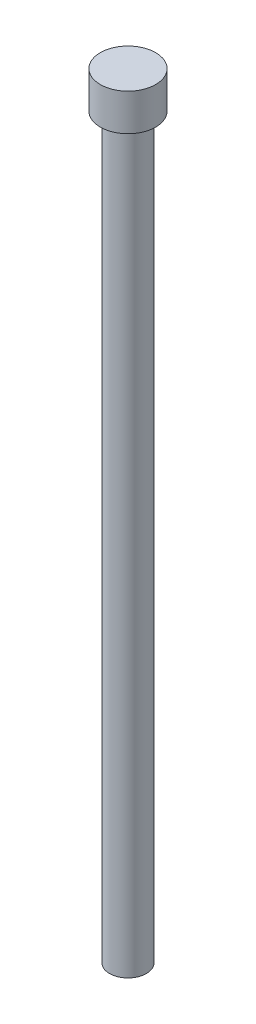
ISO-10303-21;
HEADER;
FILE_DESCRIPTION(('STEP AP214'),'2;1');
FILE_NAME('part.step','',(''),(''),'','','');
FILE_SCHEMA(('AUTOMOTIVE_DESIGN { 1 0 10303 214 1 1 1 1 }'));
ENDSEC;
DATA;
#1=APPLICATION_CONTEXT('core data for automotive mechanical design processes');
#2=APPLICATION_PROTOCOL_DEFINITION('international standard','automotive_design',2000,#1);
#3=PRODUCT_CONTEXT('',#1,'mechanical');
#4=PRODUCT('Part','Part','',(#3));
#5=PRODUCT_RELATED_PRODUCT_CATEGORY('part','',(#4));
#6=PRODUCT_DEFINITION_FORMATION('','',#4);
#7=PRODUCT_DEFINITION_CONTEXT('part definition',#1,'design');
#8=PRODUCT_DEFINITION('design','',#6,#7);
#9=PRODUCT_DEFINITION_SHAPE('','',#8);
#10=(LENGTH_UNIT() NAMED_UNIT(*) SI_UNIT(.MILLI.,.METRE.));
#11=(NAMED_UNIT(*) PLANE_ANGLE_UNIT() SI_UNIT($,.RADIAN.));
#12=(NAMED_UNIT(*) SI_UNIT($,.STERADIAN.) SOLID_ANGLE_UNIT());
#13=UNCERTAINTY_MEASURE_WITH_UNIT(LENGTH_MEASURE(1.E-05),#10,'distance_accuracy_value','');
#14=(GEOMETRIC_REPRESENTATION_CONTEXT(3) GLOBAL_UNCERTAINTY_ASSIGNED_CONTEXT((#13)) GLOBAL_UNIT_ASSIGNED_CONTEXT((#10,
#11,#12)) REPRESENTATION_CONTEXT('',''));
#15=CARTESIAN_POINT('',(0.,0.,0.));
#16=DIRECTION('',(0.,0.,1.));
#17=DIRECTION('',(1.,0.,0.));
#18=AXIS2_PLACEMENT_3D('',#15,#16,#17);
#19=CARTESIAN_POINT('',(0.,6.35,0.));
#20=DIRECTION('',(0.,-1.,0.));
#21=DIRECTION('',(0.,0.,-1.));
#22=AXIS2_PLACEMENT_3D('',#19,#20,#21);
#23=CYLINDRICAL_SURFACE('',#22,4.7625);
#24=CARTESIAN_POINT('',(0.,6.35,0.));
#25=DIRECTION('',(0.,1.,0.));
#26=DIRECTION('',(0.,0.,1.));
#27=AXIS2_PLACEMENT_3D('',#24,#25,#26);
#28=CIRCLE('',#27,4.7625);
#29=CARTESIAN_POINT('',(0.,6.35,4.7625));
#30=VERTEX_POINT('',#29);
#31=EDGE_CURVE('E38',#30,#30,#28,.T.);
#32=ORIENTED_EDGE('',*,*,#31,.F.);
#33=EDGE_LOOP('',(#32));
#34=FACE_BOUND('',#33,.T.);
#35=CARTESIAN_POINT('',(0.,0.,0.));
#36=DIRECTION('',(0.,1.,0.));
#37=DIRECTION('',(0.,0.,1.));
#38=AXIS2_PLACEMENT_3D('',#35,#36,#37);
#39=CIRCLE('',#38,4.7625);
#40=CARTESIAN_POINT('',(0.,0.,4.7625));
#41=VERTEX_POINT('',#40);
#42=EDGE_CURVE('E34',#41,#41,#39,.T.);
#43=ORIENTED_EDGE('',*,*,#42,.T.);
#44=EDGE_LOOP('',(#43));
#45=FACE_BOUND('',#44,.T.);
#46=ADVANCED_FACE('F31',(#34,#45),#23,.T.);
#47=CARTESIAN_POINT('',(0.,6.35,0.));
#48=DIRECTION('',(0.,1.,0.));
#49=DIRECTION('',(0.,0.,1.));
#50=AXIS2_PLACEMENT_3D('',#47,#48,#49);
#51=PLANE('',#50);
#52=ORIENTED_EDGE('',*,*,#31,.T.);
#53=EDGE_LOOP('',(#52));
#54=FACE_BOUND('',#53,.T.);
#55=ADVANCED_FACE('F55',(#54),#51,.T.);
#56=CARTESIAN_POINT('',(0.,0.,0.));
#57=DIRECTION('',(0.,1.,0.));
#58=DIRECTION('',(0.,0.,1.));
#59=AXIS2_PLACEMENT_3D('',#56,#57,#58);
#60=PLANE('',#59);
#61=CARTESIAN_POINT('',(0.,0.,0.));
#62=DIRECTION('',(0.,-1.,0.));
#63=DIRECTION('',(0.,0.,-1.));
#64=AXIS2_PLACEMENT_3D('',#61,#62,#63);
#65=CIRCLE('',#64,3.175);
#66=CARTESIAN_POINT('',(0.,0.,-3.175));
#67=VERTEX_POINT('',#66);
#68=EDGE_CURVE('E10',#67,#67,#65,.T.);
#69=ORIENTED_EDGE('',*,*,#68,.F.);
#70=EDGE_LOOP('',(#69));
#71=FACE_BOUND('',#70,.T.);
#72=ORIENTED_EDGE('',*,*,#42,.F.);
#73=EDGE_LOOP('',(#72));
#74=FACE_BOUND('',#73,.T.);
#75=ADVANCED_FACE('F52',(#71,#74),#60,.F.);
#76=CARTESIAN_POINT('',(0.,-127.,0.));
#77=DIRECTION('',(0.,1.,0.));
#78=DIRECTION('',(0.,0.,1.));
#79=AXIS2_PLACEMENT_3D('',#76,#77,#78);
#80=CYLINDRICAL_SURFACE('',#79,3.175);
#81=CARTESIAN_POINT('',(0.,-127.,0.));
#82=DIRECTION('',(0.,-1.,0.));
#83=DIRECTION('',(0.,0.,-1.));
#84=AXIS2_PLACEMENT_3D('',#81,#82,#83);
#85=CIRCLE('',#84,3.175);
#86=CARTESIAN_POINT('',(0.,-127.,-3.175));
#87=VERTEX_POINT('',#86);
#88=EDGE_CURVE('E44',#87,#87,#85,.T.);
#89=ORIENTED_EDGE('',*,*,#88,.F.);
#90=EDGE_LOOP('',(#89));
#91=FACE_BOUND('',#90,.T.);
#92=ORIENTED_EDGE('',*,*,#68,.T.);
#93=EDGE_LOOP('',(#92));
#94=FACE_BOUND('',#93,.T.);
#95=ADVANCED_FACE('F54',(#91,#94),#80,.T.);
#96=CARTESIAN_POINT('',(0.,-127.,0.));
#97=DIRECTION('',(0.,-1.,0.));
#98=DIRECTION('',(0.,0.,-1.));
#99=AXIS2_PLACEMENT_3D('',#96,#97,#98);
#100=PLANE('',#99);
#101=ORIENTED_EDGE('',*,*,#88,.T.);
#102=EDGE_LOOP('',(#101));
#103=FACE_BOUND('',#102,.T.);
#104=ADVANCED_FACE('F61',(#103),#100,.T.);
#105=CLOSED_SHELL('',(#46,#55,#75,#95,#104));
#106=MANIFOLD_SOLID_BREP('B2',#105);
#107=ADVANCED_BREP_SHAPE_REPRESENTATION('',(#18,#106),#14);
#108=SHAPE_DEFINITION_REPRESENTATION(#9,#107);
ENDSEC;
END-ISO-10303-21;
